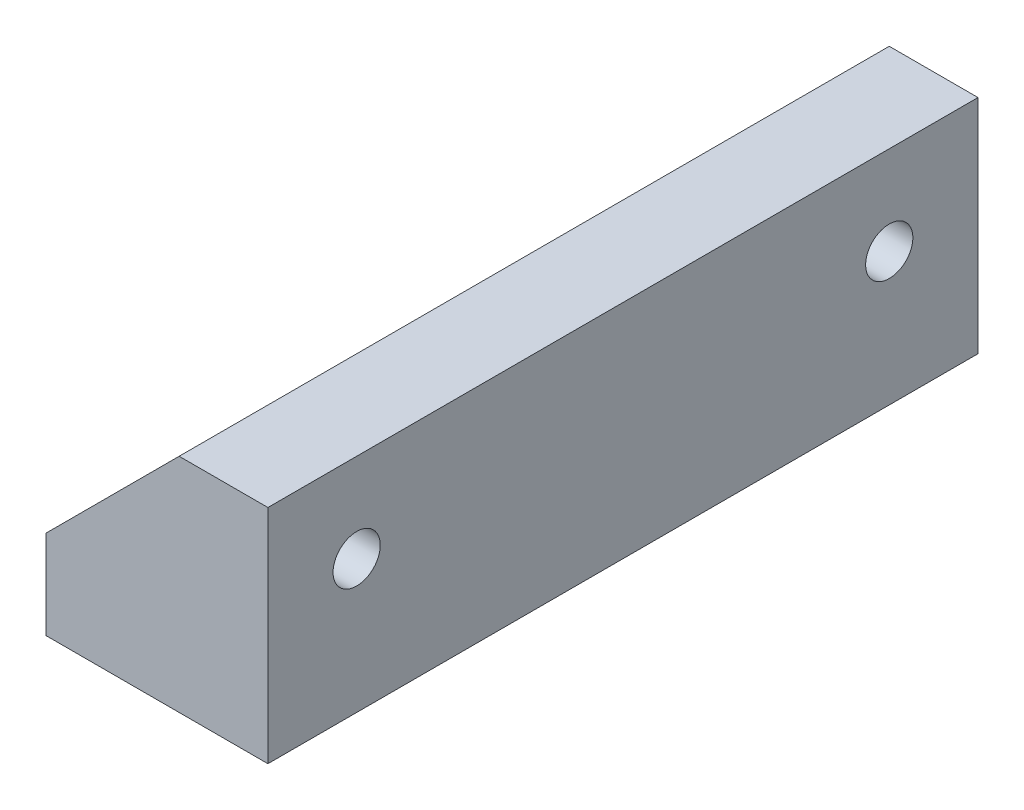
ISO-10303-21;
HEADER;
FILE_DESCRIPTION(('STEP AP214'),'2;1');
FILE_NAME('part.step','',(''),(''),'','','');
FILE_SCHEMA(('AUTOMOTIVE_DESIGN { 1 0 10303 214 1 1 1 1 }'));
ENDSEC;
DATA;
#1=APPLICATION_CONTEXT('core data for automotive mechanical design processes');
#2=APPLICATION_PROTOCOL_DEFINITION('international standard','automotive_design',2000,#1);
#3=PRODUCT_CONTEXT('',#1,'mechanical');
#4=PRODUCT('Part','Part','',(#3));
#5=PRODUCT_RELATED_PRODUCT_CATEGORY('part','',(#4));
#6=PRODUCT_DEFINITION_FORMATION('','',#4);
#7=PRODUCT_DEFINITION_CONTEXT('part definition',#1,'design');
#8=PRODUCT_DEFINITION('design','',#6,#7);
#9=PRODUCT_DEFINITION_SHAPE('','',#8);
#10=(LENGTH_UNIT() NAMED_UNIT(*) SI_UNIT(.MILLI.,.METRE.));
#11=(NAMED_UNIT(*) PLANE_ANGLE_UNIT() SI_UNIT($,.RADIAN.));
#12=(NAMED_UNIT(*) SI_UNIT($,.STERADIAN.) SOLID_ANGLE_UNIT());
#13=UNCERTAINTY_MEASURE_WITH_UNIT(LENGTH_MEASURE(1.E-05),#10,'distance_accuracy_value','');
#14=(GEOMETRIC_REPRESENTATION_CONTEXT(3) GLOBAL_UNCERTAINTY_ASSIGNED_CONTEXT((#13)) GLOBAL_UNIT_ASSIGNED_CONTEXT((#10,
#11,#12)) REPRESENTATION_CONTEXT('',''));
#15=CARTESIAN_POINT('',(0.,0.,0.));
#16=DIRECTION('',(0.,0.,1.));
#17=DIRECTION('',(1.,0.,0.));
#18=AXIS2_PLACEMENT_3D('',#15,#16,#17);
#19=CARTESIAN_POINT('',(-15.875,15.875,50.8));
#20=DIRECTION('',(-1.,0.,0.));
#21=DIRECTION('',(0.,0.,1.));
#22=AXIS2_PLACEMENT_3D('',#19,#20,#21);
#23=PLANE('',#22);
#24=DIRECTION('',(0.,0.,1.));
#25=VECTOR('',#24,1.);
#26=CARTESIAN_POINT('',(-15.875,-3.17500000000021,-50.801));
#27=LINE('',#26,#25);
#28=CARTESIAN_POINT('',(-15.875,-3.17500000000021,-50.8));
#29=VERTEX_POINT('',#28);
#30=CARTESIAN_POINT('',(-15.875,-3.17500000000021,50.8));
#31=VERTEX_POINT('',#30);
#32=EDGE_CURVE('E108',#29,#31,#27,.T.);
#33=ORIENTED_EDGE('',*,*,#32,.F.);
#34=DIRECTION('',(0.,-1.,0.));
#35=VECTOR('',#34,1.);
#36=CARTESIAN_POINT('',(-15.875,15.875,-50.8));
#37=LINE('',#36,#35);
#38=CARTESIAN_POINT('',(-15.875,-15.875,-50.8));
#39=VERTEX_POINT('',#38);
#40=EDGE_CURVE('E104',#29,#39,#37,.T.);
#41=ORIENTED_EDGE('',*,*,#40,.T.);
#42=DIRECTION('',(0.,0.,-1.));
#43=VECTOR('',#42,1.);
#44=CARTESIAN_POINT('',(-15.875,-15.875,50.8));
#45=LINE('',#44,#43);
#46=CARTESIAN_POINT('',(-15.875,-15.875,50.8));
#47=VERTEX_POINT('',#46);
#48=EDGE_CURVE('E97',#47,#39,#45,.T.);
#49=ORIENTED_EDGE('',*,*,#48,.F.);
#50=DIRECTION('',(0.,-1.,0.));
#51=VECTOR('',#50,1.);
#52=CARTESIAN_POINT('',(-15.875,15.875,50.8));
#53=LINE('',#52,#51);
#54=EDGE_CURVE('E11',#31,#47,#53,.T.);
#55=ORIENTED_EDGE('',*,*,#54,.F.);
#56=EDGE_LOOP('',(#33,#41,#49,#55));
#57=FACE_BOUND('',#56,.T.);
#58=ADVANCED_FACE('F42',(#57),#23,.T.);
#59=CARTESIAN_POINT('',(-15.875,15.875,50.8));
#60=DIRECTION('',(0.,0.,-1.));
#61=DIRECTION('',(-1.,0.,0.));
#62=AXIS2_PLACEMENT_3D('',#59,#60,#61);
#63=PLANE('',#62);
#64=DIRECTION('',(1.,0.,0.));
#65=VECTOR('',#64,1.);
#66=CARTESIAN_POINT('',(-15.875,15.875,50.8));
#67=LINE('',#66,#65);
#68=CARTESIAN_POINT('',(3.175,15.875,50.8));
#69=VERTEX_POINT('',#68);
#70=CARTESIAN_POINT('',(15.875,15.875,50.8));
#71=VERTEX_POINT('',#70);
#72=EDGE_CURVE('E67',#69,#71,#67,.T.);
#73=ORIENTED_EDGE('',*,*,#72,.F.);
#74=DIRECTION('',(0.707106781186544,0.707106781186551,0.));
#75=VECTOR('',#74,1.);
#76=CARTESIAN_POINT('',(3.175,15.875,50.8));
#77=LINE('',#76,#75);
#78=EDGE_CURVE('E59',#31,#69,#77,.T.);
#79=ORIENTED_EDGE('',*,*,#78,.F.);
#80=ORIENTED_EDGE('',*,*,#54,.T.);
#81=DIRECTION('',(1.,0.,0.));
#82=VECTOR('',#81,1.);
#83=CARTESIAN_POINT('',(-15.875,-15.875,50.8));
#84=LINE('',#83,#82);
#85=CARTESIAN_POINT('',(15.875,-15.875,50.8));
#86=VERTEX_POINT('',#85);
#87=EDGE_CURVE('E87',#47,#86,#84,.T.);
#88=ORIENTED_EDGE('',*,*,#87,.T.);
#89=DIRECTION('',(0.,-1.,0.));
#90=VECTOR('',#89,1.);
#91=CARTESIAN_POINT('',(15.875,15.875,50.8));
#92=LINE('',#91,#90);
#93=EDGE_CURVE('E51',#71,#86,#92,.T.);
#94=ORIENTED_EDGE('',*,*,#93,.F.);
#95=EDGE_LOOP('',(#73,#79,#80,#88,#94));
#96=FACE_BOUND('',#95,.T.);
#97=ADVANCED_FACE('F86',(#96),#63,.F.);
#98=CARTESIAN_POINT('',(15.875,15.875,50.8));
#99=DIRECTION('',(-1.,0.,0.));
#100=DIRECTION('',(0.,0.,1.));
#101=AXIS2_PLACEMENT_3D('',#98,#99,#100);
#102=PLANE('',#101);
#103=CARTESIAN_POINT('',(15.875,3.175,-38.1));
#104=DIRECTION('',(-1.,0.,0.));
#105=DIRECTION('',(0.,0.,1.));
#106=AXIS2_PLACEMENT_3D('',#103,#104,#105);
#107=CIRCLE('',#106,3.37819999999999);
#108=CARTESIAN_POINT('',(15.875,3.175,-34.7218));
#109=VERTEX_POINT('',#108);
#110=EDGE_CURVE('E382',#109,#109,#107,.T.);
#111=ORIENTED_EDGE('',*,*,#110,.T.);
#112=EDGE_LOOP('',(#111));
#113=FACE_BOUND('',#112,.T.);
#114=CARTESIAN_POINT('',(15.875,3.175,38.1));
#115=DIRECTION('',(-1.,0.,0.));
#116=DIRECTION('',(0.,0.,1.));
#117=AXIS2_PLACEMENT_3D('',#114,#115,#116);
#118=CIRCLE('',#117,3.37819999999999);
#119=CARTESIAN_POINT('',(15.875,3.175,41.4782));
#120=VERTEX_POINT('',#119);
#121=EDGE_CURVE('E130',#120,#120,#118,.T.);
#122=ORIENTED_EDGE('',*,*,#121,.T.);
#123=EDGE_LOOP('',(#122));
#124=FACE_BOUND('',#123,.T.);
#125=DIRECTION('',(0.,0.,-1.));
#126=VECTOR('',#125,1.);
#127=CARTESIAN_POINT('',(15.875,-15.875,50.8));
#128=LINE('',#127,#126);
#129=CARTESIAN_POINT('',(15.875,-15.875,-50.8));
#130=VERTEX_POINT('',#129);
#131=EDGE_CURVE('E99',#86,#130,#128,.T.);
#132=ORIENTED_EDGE('',*,*,#131,.T.);
#133=DIRECTION('',(0.,-1.,0.));
#134=VECTOR('',#133,1.);
#135=CARTESIAN_POINT('',(15.875,15.875,-50.8));
#136=LINE('',#135,#134);
#137=CARTESIAN_POINT('',(15.875,15.875,-50.8));
#138=VERTEX_POINT('',#137);
#139=EDGE_CURVE('E122',#138,#130,#136,.T.);
#140=ORIENTED_EDGE('',*,*,#139,.F.);
#141=DIRECTION('',(0.,0.,-1.));
#142=VECTOR('',#141,1.);
#143=CARTESIAN_POINT('',(15.875,15.875,50.8));
#144=LINE('',#143,#142);
#145=EDGE_CURVE('E169',#71,#138,#144,.T.);
#146=ORIENTED_EDGE('',*,*,#145,.F.);
#147=ORIENTED_EDGE('',*,*,#93,.T.);
#148=EDGE_LOOP('',(#132,#140,#146,#147));
#149=FACE_BOUND('',#148,.T.);
#150=ADVANCED_FACE('F178',(#113,#124,#149),#102,.F.);
#151=CARTESIAN_POINT('',(-15.875,15.875,-50.8));
#152=DIRECTION('',(0.,0.,-1.));
#153=DIRECTION('',(-1.,0.,0.));
#154=AXIS2_PLACEMENT_3D('',#151,#152,#153);
#155=PLANE('',#154);
#156=DIRECTION('',(0.707106781186544,0.707106781186551,0.));
#157=VECTOR('',#156,1.);
#158=CARTESIAN_POINT('',(3.175,15.875,-50.8));
#159=LINE('',#158,#157);
#160=CARTESIAN_POINT('',(3.175,15.875,-50.8));
#161=VERTEX_POINT('',#160);
#162=EDGE_CURVE('E160',#29,#161,#159,.T.);
#163=ORIENTED_EDGE('',*,*,#162,.T.);
#164=DIRECTION('',(1.,0.,0.));
#165=VECTOR('',#164,1.);
#166=CARTESIAN_POINT('',(-15.875,15.875,-50.8));
#167=LINE('',#166,#165);
#168=EDGE_CURVE('E101',#161,#138,#167,.T.);
#169=ORIENTED_EDGE('',*,*,#168,.T.);
#170=ORIENTED_EDGE('',*,*,#139,.T.);
#171=DIRECTION('',(1.,0.,0.));
#172=VECTOR('',#171,1.);
#173=CARTESIAN_POINT('',(-15.875,-15.875,-50.8));
#174=LINE('',#173,#172);
#175=EDGE_CURVE('E107',#39,#130,#174,.T.);
#176=ORIENTED_EDGE('',*,*,#175,.F.);
#177=ORIENTED_EDGE('',*,*,#40,.F.);
#178=EDGE_LOOP('',(#163,#169,#170,#176,#177));
#179=FACE_BOUND('',#178,.T.);
#180=ADVANCED_FACE('F180',(#179),#155,.T.);
#181=CARTESIAN_POINT('',(0.,15.875,0.));
#182=DIRECTION('',(0.,-1.,0.));
#183=DIRECTION('',(0.,0.,-1.));
#184=AXIS2_PLACEMENT_3D('',#181,#182,#183);
#185=PLANE('',#184);
#186=ORIENTED_EDGE('',*,*,#168,.F.);
#187=DIRECTION('',(0.,0.,1.));
#188=VECTOR('',#187,1.);
#189=CARTESIAN_POINT('',(3.175,15.875,-50.801));
#190=LINE('',#189,#188);
#191=EDGE_CURVE('E113',#161,#69,#190,.T.);
#192=ORIENTED_EDGE('',*,*,#191,.T.);
#193=ORIENTED_EDGE('',*,*,#72,.T.);
#194=ORIENTED_EDGE('',*,*,#145,.T.);
#195=EDGE_LOOP('',(#186,#192,#193,#194));
#196=FACE_BOUND('',#195,.T.);
#197=ADVANCED_FACE('F175',(#196),#185,.F.);
#198=CARTESIAN_POINT('',(0.,-15.875,0.));
#199=DIRECTION('',(0.,-1.,0.));
#200=DIRECTION('',(0.,0.,-1.));
#201=AXIS2_PLACEMENT_3D('',#198,#199,#200);
#202=PLANE('',#201);
#203=ORIENTED_EDGE('',*,*,#48,.T.);
#204=ORIENTED_EDGE('',*,*,#175,.T.);
#205=ORIENTED_EDGE('',*,*,#131,.F.);
#206=ORIENTED_EDGE('',*,*,#87,.F.);
#207=EDGE_LOOP('',(#203,#204,#205,#206));
#208=FACE_BOUND('',#207,.T.);
#209=ADVANCED_FACE('F95',(#208),#202,.T.);
#210=CARTESIAN_POINT('',(3.175,15.875,-50.801));
#211=DIRECTION('',(0.707106781186551,-0.707106781186544,0.));
#212=DIRECTION('',(0.707106781186544,0.707106781186551,0.));
#213=AXIS2_PLACEMENT_3D('',#210,#211,#212);
#214=PLANE('',#213);
#215=CARTESIAN_POINT('',(-9.52499999999986,3.175,-38.1));
#216=DIRECTION('',(0.707106781186551,-0.707106781186544,0.));
#217=DIRECTION('',(-0.707106781186544,-0.707106781186551,0.));
#218=AXIS2_PLACEMENT_3D('',#215,#216,#217);
#219=ELLIPSE('',#218,7.85772410593546,5.55625);
#220=CARTESIAN_POINT('',(-15.0812499999998,-2.38125,-38.1));
#221=VERTEX_POINT('',#220);
#222=EDGE_CURVE('E45',#221,#221,#219,.T.);
#223=ORIENTED_EDGE('',*,*,#222,.T.);
#224=EDGE_LOOP('',(#223));
#225=FACE_BOUND('',#224,.T.);
#226=CARTESIAN_POINT('',(-9.52499999999986,3.175,38.1));
#227=DIRECTION('',(0.707106781186551,-0.707106781186544,0.));
#228=DIRECTION('',(-0.707106781186544,-0.707106781186551,0.));
#229=AXIS2_PLACEMENT_3D('',#226,#227,#228);
#230=ELLIPSE('',#229,7.85772410593546,5.55625);
#231=CARTESIAN_POINT('',(-15.0812499999998,-2.38125,38.1));
#232=VERTEX_POINT('',#231);
#233=EDGE_CURVE('E126',#232,#232,#230,.T.);
#234=ORIENTED_EDGE('',*,*,#233,.T.);
#235=EDGE_LOOP('',(#234));
#236=FACE_BOUND('',#235,.T.);
#237=CARTESIAN_POINT('',(-6.34999999999999,6.34999999999992,-25.4));
#238=DIRECTION('',(-0.707106781186551,0.707106781186544,0.));
#239=DIRECTION('',(-0.707106781186544,-0.707106781186551,0.));
#240=AXIS2_PLACEMENT_3D('',#237,#238,#239);
#241=CIRCLE('',#240,2.5527);
#242=CARTESIAN_POINT('',(-8.15503148033488,4.54496851966501,-25.4));
#243=VERTEX_POINT('',#242);
#244=EDGE_CURVE('E129',#243,#243,#241,.T.);
#245=ORIENTED_EDGE('',*,*,#244,.F.);
#246=EDGE_LOOP('',(#245));
#247=FACE_BOUND('',#246,.T.);
#248=CARTESIAN_POINT('',(-6.34999999999999,6.34999999999992,25.4));
#249=DIRECTION('',(-0.707106781186551,0.707106781186544,0.));
#250=DIRECTION('',(-0.707106781186544,-0.707106781186551,0.));
#251=AXIS2_PLACEMENT_3D('',#248,#249,#250);
#252=CIRCLE('',#251,2.5527);
#253=CARTESIAN_POINT('',(-8.15503148033488,4.54496851966501,25.4));
#254=VERTEX_POINT('',#253);
#255=EDGE_CURVE('E152',#254,#254,#252,.T.);
#256=ORIENTED_EDGE('',*,*,#255,.F.);
#257=EDGE_LOOP('',(#256));
#258=FACE_BOUND('',#257,.T.);
#259=ORIENTED_EDGE('',*,*,#32,.T.);
#260=ORIENTED_EDGE('',*,*,#78,.T.);
#261=ORIENTED_EDGE('',*,*,#191,.F.);
#262=ORIENTED_EDGE('',*,*,#162,.F.);
#263=EDGE_LOOP('',(#259,#260,#261,#262));
#264=FACE_BOUND('',#263,.T.);
#265=ADVANCED_FACE('F185',(#225,#236,#247,#258,#264),#214,.F.);
#266=CARTESIAN_POINT('',(2.63025612106922,-2.63025612106919,25.4));
#267=DIRECTION('',(-0.707106781186551,0.707106781186544,0.));
#268=DIRECTION('',(-0.707106781186544,-0.707106781186551,0.));
#269=AXIS2_PLACEMENT_3D('',#266,#267,#268);
#270=CONICAL_SURFACE('',#269,2.55269999999999,1.02974425867665);
#271=CARTESIAN_POINT('',(3.71482845370748,-3.71482845370744,25.4));
#272=VERTEX_POINT('',#271);
#273=VERTEX_LOOP('',#272);
#274=FACE_BOUND('',#273,.T.);
#275=CARTESIAN_POINT('',(2.63025612106922,-2.63025612106919,25.4));
#276=DIRECTION('',(-0.707106781186551,0.707106781186544,0.));
#277=DIRECTION('',(-0.707106781186544,-0.707106781186551,0.));
#278=AXIS2_PLACEMENT_3D('',#275,#276,#277);
#279=CIRCLE('',#278,2.55269999999999);
#280=CARTESIAN_POINT('',(0.82522464073433,-4.4352876014041,25.4));
#281=VERTEX_POINT('',#280);
#282=EDGE_CURVE('E156',#281,#281,#279,.T.);
#283=ORIENTED_EDGE('',*,*,#282,.T.);
#284=EDGE_LOOP('',(#283));
#285=FACE_BOUND('',#284,.T.);
#286=ADVANCED_FACE('F209',(#274,#285),#270,.F.);
#287=CARTESIAN_POINT('',(-6.34999999999999,6.34999999999992,25.4));
#288=DIRECTION('',(-0.707106781186551,0.707106781186544,0.));
#289=DIRECTION('',(-0.707106781186544,-0.707106781186551,0.));
#290=AXIS2_PLACEMENT_3D('',#287,#288,#289);
#291=CYLINDRICAL_SURFACE('',#290,2.5527);
#292=ORIENTED_EDGE('',*,*,#282,.F.);
#293=EDGE_LOOP('',(#292));
#294=FACE_BOUND('',#293,.T.);
#295=ORIENTED_EDGE('',*,*,#255,.T.);
#296=EDGE_LOOP('',(#295));
#297=FACE_BOUND('',#296,.T.);
#298=ADVANCED_FACE('F197',(#294,#297),#291,.F.);
#299=CARTESIAN_POINT('',(2.63025612106922,-2.63025612106919,-25.4));
#300=DIRECTION('',(-0.707106781186551,0.707106781186544,0.));
#301=DIRECTION('',(-0.707106781186544,-0.707106781186551,0.));
#302=AXIS2_PLACEMENT_3D('',#299,#300,#301);
#303=CONICAL_SURFACE('',#302,2.55269999999999,1.02974425867665);
#304=CARTESIAN_POINT('',(3.71482845370748,-3.71482845370744,-25.4));
#305=VERTEX_POINT('',#304);
#306=VERTEX_LOOP('',#305);
#307=FACE_BOUND('',#306,.T.);
#308=CARTESIAN_POINT('',(2.63025612106922,-2.63025612106919,-25.4));
#309=DIRECTION('',(-0.707106781186551,0.707106781186544,0.));
#310=DIRECTION('',(-0.707106781186544,-0.707106781186551,0.));
#311=AXIS2_PLACEMENT_3D('',#308,#309,#310);
#312=CIRCLE('',#311,2.55269999999999);
#313=CARTESIAN_POINT('',(0.82522464073433,-4.4352876014041,-25.4));
#314=VERTEX_POINT('',#313);
#315=EDGE_CURVE('E136',#314,#314,#312,.T.);
#316=ORIENTED_EDGE('',*,*,#315,.T.);
#317=EDGE_LOOP('',(#316));
#318=FACE_BOUND('',#317,.T.);
#319=ADVANCED_FACE('F193',(#307,#318),#303,.F.);
#320=CARTESIAN_POINT('',(-6.34999999999999,6.34999999999992,-25.4));
#321=DIRECTION('',(-0.707106781186551,0.707106781186544,0.));
#322=DIRECTION('',(-0.707106781186544,-0.707106781186551,0.));
#323=AXIS2_PLACEMENT_3D('',#320,#321,#322);
#324=CYLINDRICAL_SURFACE('',#323,2.5527);
#325=ORIENTED_EDGE('',*,*,#315,.F.);
#326=EDGE_LOOP('',(#325));
#327=FACE_BOUND('',#326,.T.);
#328=ORIENTED_EDGE('',*,*,#244,.T.);
#329=EDGE_LOOP('',(#328));
#330=FACE_BOUND('',#329,.T.);
#331=ADVANCED_FACE('F196',(#327,#330),#324,.F.);
#332=CARTESIAN_POINT('',(-15.875,3.175,38.1));
#333=DIRECTION('',(-1.,0.,0.));
#334=DIRECTION('',(0.,0.,1.));
#335=AXIS2_PLACEMENT_3D('',#332,#333,#334);
#336=CYLINDRICAL_SURFACE('',#335,5.55625);
#337=CARTESIAN_POINT('',(4.445,3.175,38.1));
#338=DIRECTION('',(-1.,0.,0.));
#339=DIRECTION('',(0.,0.,1.));
#340=AXIS2_PLACEMENT_3D('',#337,#338,#339);
#341=CIRCLE('',#340,5.55625);
#342=CARTESIAN_POINT('',(4.445,3.175,43.65625));
#343=VERTEX_POINT('',#342);
#344=EDGE_CURVE('E145',#343,#343,#341,.T.);
#345=ORIENTED_EDGE('',*,*,#344,.F.);
#346=EDGE_LOOP('',(#345));
#347=FACE_BOUND('',#346,.T.);
#348=ORIENTED_EDGE('',*,*,#233,.F.);
#349=EDGE_LOOP('',(#348));
#350=FACE_BOUND('',#349,.T.);
#351=ADVANCED_FACE('F203',(#347,#350),#336,.F.);
#352=CARTESIAN_POINT('',(-15.875,3.175,38.1));
#353=DIRECTION('',(-1.,0.,0.));
#354=DIRECTION('',(0.,0.,1.));
#355=AXIS2_PLACEMENT_3D('',#352,#353,#354);
#356=CYLINDRICAL_SURFACE('',#355,3.37819999999999);
#357=ORIENTED_EDGE('',*,*,#121,.F.);
#358=EDGE_LOOP('',(#357));
#359=FACE_BOUND('',#358,.T.);
#360=CARTESIAN_POINT('',(4.445,3.175,38.1));
#361=DIRECTION('',(-1.,0.,0.));
#362=DIRECTION('',(0.,0.,1.));
#363=AXIS2_PLACEMENT_3D('',#360,#361,#362);
#364=CIRCLE('',#363,3.3782);
#365=CARTESIAN_POINT('',(4.445,3.175,41.4782));
#366=VERTEX_POINT('',#365);
#367=EDGE_CURVE('E139',#366,#366,#364,.T.);
#368=ORIENTED_EDGE('',*,*,#367,.T.);
#369=EDGE_LOOP('',(#368));
#370=FACE_BOUND('',#369,.T.);
#371=ADVANCED_FACE('F318',(#359,#370),#356,.F.);
#372=CARTESIAN_POINT('',(4.445,6.5532,38.1));
#373=DIRECTION('',(1.,0.,0.));
#374=DIRECTION('',(0.,0.,-1.));
#375=AXIS2_PLACEMENT_3D('',#372,#373,#374);
#376=PLANE('',#375);
#377=ORIENTED_EDGE('',*,*,#367,.F.);
#378=EDGE_LOOP('',(#377));
#379=FACE_BOUND('',#378,.T.);
#380=ORIENTED_EDGE('',*,*,#344,.T.);
#381=EDGE_LOOP('',(#380));
#382=FACE_BOUND('',#381,.T.);
#383=ADVANCED_FACE('F325',(#379,#382),#376,.F.);
#384=CARTESIAN_POINT('',(-15.875,3.175,-38.1));
#385=DIRECTION('',(-1.,0.,0.));
#386=DIRECTION('',(0.,0.,1.));
#387=AXIS2_PLACEMENT_3D('',#384,#385,#386);
#388=CYLINDRICAL_SURFACE('',#387,5.55625);
#389=CARTESIAN_POINT('',(4.445,3.175,-38.1));
#390=DIRECTION('',(-1.,0.,0.));
#391=DIRECTION('',(0.,0.,1.));
#392=AXIS2_PLACEMENT_3D('',#389,#390,#391);
#393=CIRCLE('',#392,5.55625);
#394=CARTESIAN_POINT('',(4.445,3.175,-32.54375));
#395=VERTEX_POINT('',#394);
#396=EDGE_CURVE('E378',#395,#395,#393,.T.);
#397=ORIENTED_EDGE('',*,*,#396,.F.);
#398=EDGE_LOOP('',(#397));
#399=FACE_BOUND('',#398,.T.);
#400=ORIENTED_EDGE('',*,*,#222,.F.);
#401=EDGE_LOOP('',(#400));
#402=FACE_BOUND('',#401,.T.);
#403=ADVANCED_FACE('F333',(#399,#402),#388,.F.);
#404=CARTESIAN_POINT('',(-15.875,3.175,-38.1));
#405=DIRECTION('',(-1.,0.,0.));
#406=DIRECTION('',(0.,0.,1.));
#407=AXIS2_PLACEMENT_3D('',#404,#405,#406);
#408=CYLINDRICAL_SURFACE('',#407,3.37819999999999);
#409=ORIENTED_EDGE('',*,*,#110,.F.);
#410=EDGE_LOOP('',(#409));
#411=FACE_BOUND('',#410,.T.);
#412=CARTESIAN_POINT('',(4.445,3.175,-38.1));
#413=DIRECTION('',(-1.,0.,0.));
#414=DIRECTION('',(0.,0.,1.));
#415=AXIS2_PLACEMENT_3D('',#412,#413,#414);
#416=CIRCLE('',#415,3.3782);
#417=CARTESIAN_POINT('',(4.445,3.175,-34.7218));
#418=VERTEX_POINT('',#417);
#419=EDGE_CURVE('E375',#418,#418,#416,.T.);
#420=ORIENTED_EDGE('',*,*,#419,.T.);
#421=EDGE_LOOP('',(#420));
#422=FACE_BOUND('',#421,.T.);
#423=ADVANCED_FACE('F341',(#411,#422),#408,.F.);
#424=CARTESIAN_POINT('',(4.445,6.5532,-38.1));
#425=DIRECTION('',(1.,0.,0.));
#426=DIRECTION('',(0.,0.,-1.));
#427=AXIS2_PLACEMENT_3D('',#424,#425,#426);
#428=PLANE('',#427);
#429=ORIENTED_EDGE('',*,*,#419,.F.);
#430=EDGE_LOOP('',(#429));
#431=FACE_BOUND('',#430,.T.);
#432=ORIENTED_EDGE('',*,*,#396,.T.);
#433=EDGE_LOOP('',(#432));
#434=FACE_BOUND('',#433,.T.);
#435=ADVANCED_FACE('F349',(#431,#434),#428,.F.);
#436=CLOSED_SHELL('',(#58,#97,#150,#180,#197,#209,#265,#286,#298,#319,#331,#351,#371,#383,#403,
#423,#435));
#437=MANIFOLD_SOLID_BREP('B2',#436);
#438=ADVANCED_BREP_SHAPE_REPRESENTATION('',(#18,#437),#14);
#439=SHAPE_DEFINITION_REPRESENTATION(#9,#438);
ENDSEC;
END-ISO-10303-21;
